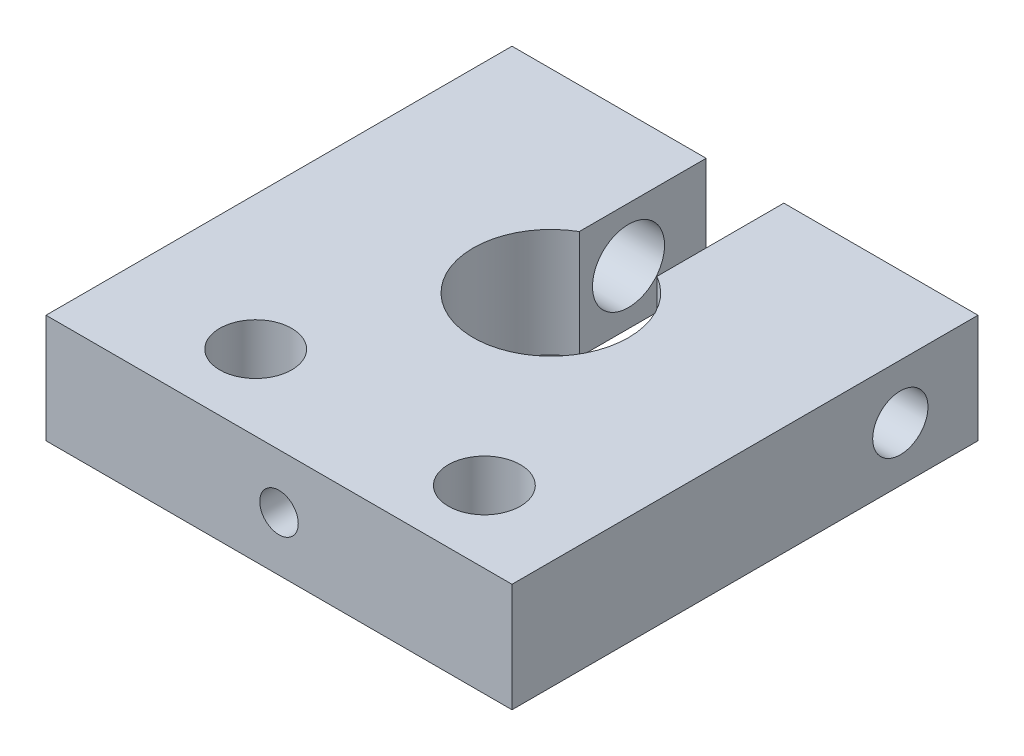
ISO-10303-21;
HEADER;
FILE_DESCRIPTION(('STEP AP214'),'2;1');
FILE_NAME('part.step','',(''),(''),'','','');
FILE_SCHEMA(('AUTOMOTIVE_DESIGN { 1 0 10303 214 1 1 1 1 }'));
ENDSEC;
DATA;
#1=APPLICATION_CONTEXT('core data for automotive mechanical design processes');
#2=APPLICATION_PROTOCOL_DEFINITION('international standard','automotive_design',2000,#1);
#3=PRODUCT_CONTEXT('',#1,'mechanical');
#4=PRODUCT('Part','Part','',(#3));
#5=PRODUCT_RELATED_PRODUCT_CATEGORY('part','',(#4));
#6=PRODUCT_DEFINITION_FORMATION('','',#4);
#7=PRODUCT_DEFINITION_CONTEXT('part definition',#1,'design');
#8=PRODUCT_DEFINITION('design','',#6,#7);
#9=PRODUCT_DEFINITION_SHAPE('','',#8);
#10=(LENGTH_UNIT() NAMED_UNIT(*) SI_UNIT(.MILLI.,.METRE.));
#11=(NAMED_UNIT(*) PLANE_ANGLE_UNIT() SI_UNIT($,.RADIAN.));
#12=(NAMED_UNIT(*) SI_UNIT($,.STERADIAN.) SOLID_ANGLE_UNIT());
#13=UNCERTAINTY_MEASURE_WITH_UNIT(LENGTH_MEASURE(1.E-05),#10,'distance_accuracy_value','');
#14=(GEOMETRIC_REPRESENTATION_CONTEXT(3) GLOBAL_UNCERTAINTY_ASSIGNED_CONTEXT((#13)) GLOBAL_UNIT_ASSIGNED_CONTEXT((#10,
#11,#12)) REPRESENTATION_CONTEXT('',''));
#15=CARTESIAN_POINT('',(0.,0.,0.));
#16=DIRECTION('',(0.,0.,1.));
#17=DIRECTION('',(1.,0.,0.));
#18=AXIS2_PLACEMENT_3D('',#15,#16,#17);
#19=CARTESIAN_POINT('',(9.525,4.445,11.1125));
#20=DIRECTION('',(-1.,0.,0.));
#21=DIRECTION('',(0.,0.,1.));
#22=AXIS2_PLACEMENT_3D('',#19,#20,#21);
#23=PLANE('',#22);
#24=DIRECTION('',(0.,0.,-1.));
#25=VECTOR('',#24,1.);
#26=CARTESIAN_POINT('',(9.525,0.,11.1125));
#27=LINE('',#26,#25);
#28=CARTESIAN_POINT('',(9.525,0.,11.1125));
#29=VERTEX_POINT('',#28);
#30=CARTESIAN_POINT('',(9.525,0.,-7.9375));
#31=VERTEX_POINT('',#30);
#32=EDGE_CURVE('E154',#29,#31,#27,.T.);
#33=ORIENTED_EDGE('',*,*,#32,.T.);
#34=DIRECTION('',(0.,-1.,0.));
#35=VECTOR('',#34,1.);
#36=CARTESIAN_POINT('',(9.525,4.445,-7.9375));
#37=LINE('',#36,#35);
#38=CARTESIAN_POINT('',(9.525,4.445,-7.9375));
#39=VERTEX_POINT('',#38);
#40=EDGE_CURVE('E160',#39,#31,#37,.T.);
#41=ORIENTED_EDGE('',*,*,#40,.F.);
#42=DIRECTION('',(0.,0.,-1.));
#43=VECTOR('',#42,1.);
#44=CARTESIAN_POINT('',(9.525,4.445,11.1125));
#45=LINE('',#44,#43);
#46=CARTESIAN_POINT('',(9.525,4.445,11.1125));
#47=VERTEX_POINT('',#46);
#48=EDGE_CURVE('E143',#47,#39,#45,.T.);
#49=ORIENTED_EDGE('',*,*,#48,.F.);
#50=DIRECTION('',(0.,-1.,0.));
#51=VECTOR('',#50,1.);
#52=CARTESIAN_POINT('',(9.525,4.445,11.1125));
#53=LINE('',#52,#51);
#54=EDGE_CURVE('E53',#47,#29,#53,.T.);
#55=ORIENTED_EDGE('',*,*,#54,.T.);
#56=EDGE_LOOP('',(#33,#41,#49,#55));
#57=FACE_BOUND('',#56,.T.);
#58=CARTESIAN_POINT('',(9.525,2.2225,-4.7625));
#59=DIRECTION('',(1.,0.,0.));
#60=DIRECTION('',(0.,0.,-1.));
#61=AXIS2_PLACEMENT_3D('',#58,#59,#60);
#62=CIRCLE('',#61,1.1303);
#63=CARTESIAN_POINT('',(9.525,2.2225,-3.6322));
#64=VERTEX_POINT('',#63);
#65=EDGE_CURVE('E253',#64,#64,#62,.T.);
#66=ORIENTED_EDGE('',*,*,#65,.F.);
#67=EDGE_LOOP('',(#66));
#68=FACE_BOUND('',#67,.T.);
#69=ADVANCED_FACE('F44',(#57,#68),#23,.F.);
#70=CARTESIAN_POINT('',(1.5875,0.,-7.9375));
#71=DIRECTION('',(1.,0.,0.));
#72=DIRECTION('',(0.,0.,-1.));
#73=AXIS2_PLACEMENT_3D('',#70,#71,#72);
#74=PLANE('',#73);
#75=DIRECTION('',(0.,0.,-1.));
#76=VECTOR('',#75,1.);
#77=CARTESIAN_POINT('',(1.5875,4.445,-7.9375));
#78=LINE('',#77,#76);
#79=CARTESIAN_POINT('',(1.5875,4.445,-2.74963065701559));
#80=VERTEX_POINT('',#79);
#81=CARTESIAN_POINT('',(1.5875,4.445,-7.9375));
#82=VERTEX_POINT('',#81);
#83=EDGE_CURVE('E126',#80,#82,#78,.T.);
#84=ORIENTED_EDGE('',*,*,#83,.T.);
#85=DIRECTION('',(0.,1.,0.));
#86=VECTOR('',#85,1.);
#87=CARTESIAN_POINT('',(1.5875,0.,-7.9375));
#88=LINE('',#87,#86);
#89=CARTESIAN_POINT('',(1.5875,0.,-7.9375));
#90=VERTEX_POINT('',#89);
#91=EDGE_CURVE('E134',#90,#82,#88,.T.);
#92=ORIENTED_EDGE('',*,*,#91,.F.);
#93=DIRECTION('',(0.,0.,-1.));
#94=VECTOR('',#93,1.);
#95=CARTESIAN_POINT('',(1.5875,0.,-7.9375));
#96=LINE('',#95,#94);
#97=CARTESIAN_POINT('',(1.5875,0.,-2.74963065701559));
#98=VERTEX_POINT('',#97);
#99=EDGE_CURVE('E61',#98,#90,#96,.T.);
#100=ORIENTED_EDGE('',*,*,#99,.F.);
#101=DIRECTION('',(0.,1.,0.));
#102=VECTOR('',#101,1.);
#103=CARTESIAN_POINT('',(1.5875,0.,-2.74963065701559));
#104=LINE('',#103,#102);
#105=EDGE_CURVE('E117',#98,#80,#104,.T.);
#106=ORIENTED_EDGE('',*,*,#105,.T.);
#107=EDGE_LOOP('',(#84,#92,#100,#106));
#108=FACE_BOUND('',#107,.T.);
#109=CARTESIAN_POINT('',(1.5875,2.2225,-4.7625));
#110=DIRECTION('',(1.,0.,0.));
#111=DIRECTION('',(0.,0.,-1.));
#112=AXIS2_PLACEMENT_3D('',#109,#110,#111);
#113=CIRCLE('',#112,1.1303);
#114=CARTESIAN_POINT('',(1.5875,2.2225,-3.6322));
#115=VERTEX_POINT('',#114);
#116=EDGE_CURVE('E173',#115,#115,#113,.F.);
#117=ORIENTED_EDGE('',*,*,#116,.F.);
#118=EDGE_LOOP('',(#117));
#119=FACE_BOUND('',#118,.T.);
#120=ADVANCED_FACE('F193',(#108,#119),#74,.F.);
#121=CARTESIAN_POINT('',(-9.525,4.445,-7.9375));
#122=DIRECTION('',(0.,0.,1.));
#123=DIRECTION('',(1.,0.,0.));
#124=AXIS2_PLACEMENT_3D('',#121,#122,#123);
#125=PLANE('',#124);
#126=DIRECTION('',(-1.,0.,0.));
#127=VECTOR('',#126,1.);
#128=CARTESIAN_POINT('',(-9.525,4.445,-7.9375));
#129=LINE('',#128,#127);
#130=CARTESIAN_POINT('',(-1.5875,4.445,-7.9375));
#131=VERTEX_POINT('',#130);
#132=CARTESIAN_POINT('',(-9.525,4.445,-7.9375));
#133=VERTEX_POINT('',#132);
#134=EDGE_CURVE('E145',#131,#133,#129,.T.);
#135=ORIENTED_EDGE('',*,*,#134,.F.);
#136=DIRECTION('',(0.,1.,0.));
#137=VECTOR('',#136,1.);
#138=CARTESIAN_POINT('',(-1.5875,0.,-7.9375));
#139=LINE('',#138,#137);
#140=CARTESIAN_POINT('',(-1.5875,0.,-7.9375));
#141=VERTEX_POINT('',#140);
#142=EDGE_CURVE('E130',#141,#131,#139,.T.);
#143=ORIENTED_EDGE('',*,*,#142,.F.);
#144=DIRECTION('',(-1.,0.,0.));
#145=VECTOR('',#144,1.);
#146=CARTESIAN_POINT('',(-9.525,0.,-7.9375));
#147=LINE('',#146,#145);
#148=CARTESIAN_POINT('',(-9.525,0.,-7.9375));
#149=VERTEX_POINT('',#148);
#150=EDGE_CURVE('E125',#141,#149,#147,.T.);
#151=ORIENTED_EDGE('',*,*,#150,.T.);
#152=DIRECTION('',(0.,-1.,0.));
#153=VECTOR('',#152,1.);
#154=CARTESIAN_POINT('',(-9.525,4.445,-7.9375));
#155=LINE('',#154,#153);
#156=EDGE_CURVE('E149',#133,#149,#155,.T.);
#157=ORIENTED_EDGE('',*,*,#156,.F.);
#158=EDGE_LOOP('',(#135,#143,#151,#157));
#159=FACE_BOUND('',#158,.T.);
#160=ADVANCED_FACE('F195',(#159),#125,.F.);
#161=CARTESIAN_POINT('',(0.,4.445,0.));
#162=DIRECTION('',(0.,-1.,0.));
#163=DIRECTION('',(0.,0.,-1.));
#164=AXIS2_PLACEMENT_3D('',#161,#162,#163);
#165=PLANE('',#164);
#166=CARTESIAN_POINT('',(-4.0386,4.445,8.0264));
#167=DIRECTION('',(0.,1.,0.));
#168=DIRECTION('',(0.,0.,1.));
#169=AXIS2_PLACEMENT_3D('',#166,#167,#168);
#170=CIRCLE('',#169,1.4732);
#171=CARTESIAN_POINT('',(-4.0386,4.445,9.4996));
#172=VERTEX_POINT('',#171);
#173=EDGE_CURVE('E171',#172,#172,#170,.T.);
#174=ORIENTED_EDGE('',*,*,#173,.F.);
#175=EDGE_LOOP('',(#174));
#176=FACE_BOUND('',#175,.T.);
#177=CARTESIAN_POINT('',(5.461,4.445,8.1788));
#178=DIRECTION('',(0.,1.,0.));
#179=DIRECTION('',(0.,0.,1.));
#180=AXIS2_PLACEMENT_3D('',#177,#178,#179);
#181=CIRCLE('',#180,1.4732);
#182=CARTESIAN_POINT('',(5.461,4.445,9.652));
#183=VERTEX_POINT('',#182);
#184=EDGE_CURVE('E244',#183,#183,#181,.T.);
#185=ORIENTED_EDGE('',*,*,#184,.F.);
#186=EDGE_LOOP('',(#185));
#187=FACE_BOUND('',#186,.T.);
#188=CARTESIAN_POINT('',(0.,4.445,0.));
#189=DIRECTION('',(0.,1.,0.));
#190=DIRECTION('',(0.,0.,1.));
#191=AXIS2_PLACEMENT_3D('',#188,#189,#190);
#192=CIRCLE('',#191,3.175);
#193=CARTESIAN_POINT('',(-1.5875,4.445,-2.74963065701559));
#194=VERTEX_POINT('',#193);
#195=EDGE_CURVE('E129',#194,#80,#192,.T.);
#196=ORIENTED_EDGE('',*,*,#195,.F.);
#197=DIRECTION('',(0.,0.,1.));
#198=VECTOR('',#197,1.);
#199=CARTESIAN_POINT('',(-1.5875,4.445,-7.9375));
#200=LINE('',#199,#198);
#201=EDGE_CURVE('E69',#131,#194,#200,.T.);
#202=ORIENTED_EDGE('',*,*,#201,.F.);
#203=ORIENTED_EDGE('',*,*,#134,.T.);
#204=DIRECTION('',(0.,0.,1.));
#205=VECTOR('',#204,1.);
#206=CARTESIAN_POINT('',(-9.525,4.445,11.1125));
#207=LINE('',#206,#205);
#208=CARTESIAN_POINT('',(-9.525,4.445,11.1125));
#209=VERTEX_POINT('',#208);
#210=EDGE_CURVE('E137',#133,#209,#207,.T.);
#211=ORIENTED_EDGE('',*,*,#210,.T.);
#212=DIRECTION('',(1.,0.,0.));
#213=VECTOR('',#212,1.);
#214=CARTESIAN_POINT('',(-9.525,4.445,11.1125));
#215=LINE('',#214,#213);
#216=EDGE_CURVE('E140',#209,#47,#215,.T.);
#217=ORIENTED_EDGE('',*,*,#216,.T.);
#218=ORIENTED_EDGE('',*,*,#48,.T.);
#219=EDGE_CURVE('E146',#39,#82,#129,.T.);
#220=ORIENTED_EDGE('',*,*,#219,.T.);
#221=ORIENTED_EDGE('',*,*,#83,.F.);
#222=EDGE_LOOP('',(#196,#202,#203,#211,#217,#218,#220,#221));
#223=FACE_BOUND('',#222,.T.);
#224=ADVANCED_FACE('F234',(#176,#187,#223),#165,.F.);
#225=CARTESIAN_POINT('',(0.,0.,0.));
#226=DIRECTION('',(0.,-1.,0.));
#227=DIRECTION('',(0.,0.,-1.));
#228=AXIS2_PLACEMENT_3D('',#225,#226,#227);
#229=PLANE('',#228);
#230=CARTESIAN_POINT('',(-4.0386,0.,8.0264));
#231=DIRECTION('',(0.,1.,0.));
#232=DIRECTION('',(0.,0.,1.));
#233=AXIS2_PLACEMENT_3D('',#230,#231,#232);
#234=CIRCLE('',#233,1.4732);
#235=CARTESIAN_POINT('',(-4.0386,0.,9.4996));
#236=VERTEX_POINT('',#235);
#237=EDGE_CURVE('E262',#236,#236,#234,.T.);
#238=ORIENTED_EDGE('',*,*,#237,.T.);
#239=EDGE_LOOP('',(#238));
#240=FACE_BOUND('',#239,.T.);
#241=CARTESIAN_POINT('',(5.461,0.,8.1788));
#242=DIRECTION('',(0.,1.,0.));
#243=DIRECTION('',(0.,0.,1.));
#244=AXIS2_PLACEMENT_3D('',#241,#242,#243);
#245=CIRCLE('',#244,1.4732);
#246=CARTESIAN_POINT('',(5.461,0.,9.652));
#247=VERTEX_POINT('',#246);
#248=EDGE_CURVE('E240',#247,#247,#245,.T.);
#249=ORIENTED_EDGE('',*,*,#248,.T.);
#250=EDGE_LOOP('',(#249));
#251=FACE_BOUND('',#250,.T.);
#252=DIRECTION('',(0.,0.,1.));
#253=VECTOR('',#252,1.);
#254=CARTESIAN_POINT('',(-1.5875,0.,-7.9375));
#255=LINE('',#254,#253);
#256=CARTESIAN_POINT('',(-1.5875,0.,-2.74963065701559));
#257=VERTEX_POINT('',#256);
#258=EDGE_CURVE('E111',#141,#257,#255,.T.);
#259=ORIENTED_EDGE('',*,*,#258,.T.);
#260=CARTESIAN_POINT('',(0.,0.,0.));
#261=DIRECTION('',(0.,1.,0.));
#262=DIRECTION('',(0.,0.,1.));
#263=AXIS2_PLACEMENT_3D('',#260,#261,#262);
#264=CIRCLE('',#263,3.175);
#265=EDGE_CURVE('E123',#257,#98,#264,.T.);
#266=ORIENTED_EDGE('',*,*,#265,.T.);
#267=ORIENTED_EDGE('',*,*,#99,.T.);
#268=EDGE_CURVE('E141',#31,#90,#147,.T.);
#269=ORIENTED_EDGE('',*,*,#268,.F.);
#270=ORIENTED_EDGE('',*,*,#32,.F.);
#271=DIRECTION('',(1.,0.,0.));
#272=VECTOR('',#271,1.);
#273=CARTESIAN_POINT('',(-9.525,0.,11.1125));
#274=LINE('',#273,#272);
#275=CARTESIAN_POINT('',(-9.525,0.,11.1125));
#276=VERTEX_POINT('',#275);
#277=EDGE_CURVE('E152',#276,#29,#274,.T.);
#278=ORIENTED_EDGE('',*,*,#277,.F.);
#279=DIRECTION('',(0.,0.,1.));
#280=VECTOR('',#279,1.);
#281=CARTESIAN_POINT('',(-9.525,0.,11.1125));
#282=LINE('',#281,#280);
#283=EDGE_CURVE('E132',#149,#276,#282,.T.);
#284=ORIENTED_EDGE('',*,*,#283,.F.);
#285=ORIENTED_EDGE('',*,*,#150,.F.);
#286=EDGE_LOOP('',(#259,#266,#267,#269,#270,#278,#284,#285));
#287=FACE_BOUND('',#286,.T.);
#288=ADVANCED_FACE('F122',(#240,#251,#287),#229,.T.);
#289=CARTESIAN_POINT('',(-9.525,4.445,11.1125));
#290=DIRECTION('',(1.,0.,0.));
#291=DIRECTION('',(0.,0.,-1.));
#292=AXIS2_PLACEMENT_3D('',#289,#290,#291);
#293=PLANE('',#292);
#294=CARTESIAN_POINT('',(-9.525,2.2225,-4.7625));
#295=DIRECTION('',(1.,0.,0.));
#296=DIRECTION('',(0.,0.,-1.));
#297=AXIS2_PLACEMENT_3D('',#294,#295,#296);
#298=CIRCLE('',#297,1.4732);
#299=CARTESIAN_POINT('',(-9.525,2.2225,-6.2357));
#300=VERTEX_POINT('',#299);
#301=EDGE_CURVE('E259',#300,#300,#298,.T.);
#302=ORIENTED_EDGE('',*,*,#301,.T.);
#303=EDGE_LOOP('',(#302));
#304=FACE_BOUND('',#303,.T.);
#305=ORIENTED_EDGE('',*,*,#283,.T.);
#306=DIRECTION('',(0.,-1.,0.));
#307=VECTOR('',#306,1.);
#308=CARTESIAN_POINT('',(-9.525,4.445,11.1125));
#309=LINE('',#308,#307);
#310=EDGE_CURVE('E13',#209,#276,#309,.T.);
#311=ORIENTED_EDGE('',*,*,#310,.F.);
#312=ORIENTED_EDGE('',*,*,#210,.F.);
#313=ORIENTED_EDGE('',*,*,#156,.T.);
#314=EDGE_LOOP('',(#305,#311,#312,#313));
#315=FACE_BOUND('',#314,.T.);
#316=ADVANCED_FACE('F46',(#304,#315),#293,.F.);
#317=CARTESIAN_POINT('',(-9.525,4.445,11.1125));
#318=DIRECTION('',(0.,0.,-1.));
#319=DIRECTION('',(-1.,0.,0.));
#320=AXIS2_PLACEMENT_3D('',#317,#318,#319);
#321=PLANE('',#320);
#322=CARTESIAN_POINT('',(0.,2.2225,11.1125));
#323=DIRECTION('',(0.,0.,1.));
#324=DIRECTION('',(1.,0.,0.));
#325=AXIS2_PLACEMENT_3D('',#322,#323,#324);
#326=CIRCLE('',#325,0.7874);
#327=CARTESIAN_POINT('',(0.7874,2.2225,11.1125));
#328=VERTEX_POINT('',#327);
#329=EDGE_CURVE('E172',#328,#328,#326,.T.);
#330=ORIENTED_EDGE('',*,*,#329,.F.);
#331=EDGE_LOOP('',(#330));
#332=FACE_BOUND('',#331,.T.);
#333=ORIENTED_EDGE('',*,*,#277,.T.);
#334=ORIENTED_EDGE('',*,*,#54,.F.);
#335=ORIENTED_EDGE('',*,*,#216,.F.);
#336=ORIENTED_EDGE('',*,*,#310,.T.);
#337=EDGE_LOOP('',(#333,#334,#335,#336));
#338=FACE_BOUND('',#337,.T.);
#339=ADVANCED_FACE('F212',(#332,#338),#321,.F.);
#340=ORIENTED_EDGE('',*,*,#268,.T.);
#341=ORIENTED_EDGE('',*,*,#91,.T.);
#342=ORIENTED_EDGE('',*,*,#219,.F.);
#343=ORIENTED_EDGE('',*,*,#40,.T.);
#344=EDGE_LOOP('',(#340,#341,#342,#343));
#345=FACE_BOUND('',#344,.T.);
#346=ADVANCED_FACE('F201',(#345),#125,.F.);
#347=CARTESIAN_POINT('',(0.,4.445,0.));
#348=DIRECTION('',(0.,-1.,0.));
#349=DIRECTION('',(0.,0.,-1.));
#350=AXIS2_PLACEMENT_3D('',#347,#348,#349);
#351=CYLINDRICAL_SURFACE('',#350,3.175);
#352=CARTESIAN_POINT('',(0.7874,2.2225,3.07581310225442));
#353=CARTESIAN_POINT('',(0.787398744653917,2.17900750216941,3.075813939192));
#354=CARTESIAN_POINT('',(0.783784226445853,2.13550103699984,3.07674566145374));
#355=CARTESIAN_POINT('',(0.769444212040904,2.04973664816889,3.0803625423924));
#356=CARTESIAN_POINT('',(0.75871451031931,2.00747947835965,3.08304873806023));
#357=CARTESIAN_POINT('',(0.730512083187864,1.92546662188354,3.08985205147743));
#358=CARTESIAN_POINT('',(0.713047973268174,1.88570781427514,3.09396734028734));
#359=CARTESIAN_POINT('',(0.671898613390606,1.80968029137026,3.10316287879354));
#360=CARTESIAN_POINT('',(0.648213125219557,1.7734117097853,3.10824316543701));
#361=CARTESIAN_POINT('',(0.594745480228862,1.70460863740529,3.11891943941669));
#362=CARTESIAN_POINT('',(0.564853320914092,1.67216087582295,3.12452355873939));
#363=CARTESIAN_POINT('',(0.500057836854161,1.6126842784334,3.13554546853051));
#364=CARTESIAN_POINT('',(0.465154049806476,1.58565594309829,3.14096324175205));
#365=CARTESIAN_POINT('',(0.390732789039581,1.53743138615076,3.15109190098522));
#366=CARTESIAN_POINT('',(0.351158598507653,1.51632024601062,3.15579207165152));
#367=CARTESIAN_POINT('',(0.268887241267556,1.48108236631455,3.16386323206304));
#368=CARTESIAN_POINT('',(0.226190528800391,1.4669546131789,3.1672344146853));
#369=CARTESIAN_POINT('',(0.139790139759614,1.44636200190988,3.17221027199584));
#370=CARTESIAN_POINT('',(0.0961235443472492,1.43974989496921,3.17384884607327));
#371=CARTESIAN_POINT('',(0.00827220844257335,1.43391418710287,3.17529294846481));
#372=CARTESIAN_POINT('',(-0.0359124556806585,1.43468951053071,3.17509874364066));
#373=CARTESIAN_POINT('',(-0.122524852571927,1.44350049547967,3.17292445001065));
#374=CARTESIAN_POINT('',(-0.164969881520884,1.45137723188311,3.1709834549647));
#375=CARTESIAN_POINT('',(-0.247915901823041,1.47391214765311,3.16557912503432));
#376=CARTESIAN_POINT('',(-0.288416790498507,1.48857068475941,3.16211570984276));
#377=CARTESIAN_POINT('',(-0.366745072334393,1.52438248465348,3.15399567959344));
#378=CARTESIAN_POINT('',(-0.404545374544142,1.54559255235268,3.14932868981507));
#379=CARTESIAN_POINT('',(-0.476106034644211,1.59386229878054,3.13930813357491));
#380=CARTESIAN_POINT('',(-0.509865698165378,1.62092298068023,3.13395444943371));
#381=CARTESIAN_POINT('',(-0.573334431368741,1.68097867569626,3.12297597059372));
#382=CARTESIAN_POINT('',(-0.602911621812153,1.71411258434032,3.11734775299395));
#383=CARTESIAN_POINT('',(-0.656118863638047,1.78492902507928,3.10658526700961));
#384=CARTESIAN_POINT('',(-0.679748646071947,1.82261176276347,3.10145102096949));
#385=CARTESIAN_POINT('',(-0.720472946534792,1.90171177009863,3.09224573629719));
#386=CARTESIAN_POINT('',(-0.737536183225515,1.94314578145341,3.08817981532904));
#387=CARTESIAN_POINT('',(-0.7644140444088,2.02841937179795,3.08163748493669));
#388=CARTESIAN_POINT('',(-0.774230192058727,2.07225844322203,3.07916074152135));
#389=CARTESIAN_POINT('',(-0.786117397865362,2.1598759080488,3.07614716365072));
#390=CARTESIAN_POINT('',(-0.788383246102545,2.20362622746548,3.0755615524555));
#391=CARTESIAN_POINT('',(-0.78563841377291,2.29087987623272,3.07626385331309));
#392=CARTESIAN_POINT('',(-0.780628391181266,2.33438322756007,3.07755159595384));
#393=CARTESIAN_POINT('',(-0.763644712630664,2.41918781628929,3.08180881345485));
#394=CARTESIAN_POINT('',(-0.751784048072299,2.46051318363588,3.08475098063085));
#395=CARTESIAN_POINT('',(-0.721560843905089,2.54058920748939,3.09195969992218));
#396=CARTESIAN_POINT('',(-0.703197543579799,2.57933956212605,3.09622640698274));
#397=CARTESIAN_POINT('',(-0.660081187835404,2.65399211019935,3.10570645375419));
#398=CARTESIAN_POINT('',(-0.635211433408581,2.68982473409086,3.11093650401891));
#399=CARTESIAN_POINT('',(-0.579936031663543,2.75687965259862,3.12171274313181));
#400=CARTESIAN_POINT('',(-0.549529489740265,2.7881012007029,3.12725898296862));
#401=CARTESIAN_POINT('',(-0.48315051811217,2.84583452429436,3.13820768442019));
#402=CARTESIAN_POINT('',(-0.447059655482856,2.87221167896369,3.14360326164024));
#403=CARTESIAN_POINT('',(-0.370847613185458,2.91853077035707,3.15350144612221));
#404=CARTESIAN_POINT('',(-0.330726642963906,2.9384730412783,3.15800409975364));
#405=CARTESIAN_POINT('',(-0.247869409728027,2.97118451574826,3.16558085850935));
#406=CARTESIAN_POINT('',(-0.205154367753035,2.98400500137962,3.16866514841085));
#407=CARTESIAN_POINT('',(-0.118089634527152,3.00226342277996,3.17310221692133));
#408=CARTESIAN_POINT('',(-0.0737402550265626,3.0077027590944,3.17445532401298));
#409=CARTESIAN_POINT('',(0.0140686802248654,3.01096675001191,3.17526440669889));
#410=CARTESIAN_POINT('',(0.0575205020657554,3.00899022295012,3.17476991760286));
#411=CARTESIAN_POINT('',(0.143452325637751,2.99793325870032,3.17204896452848));
#412=CARTESIAN_POINT('',(0.185932355396543,2.98885302665849,3.16982255056599));
#413=CARTESIAN_POINT('',(0.268510280526712,2.9639523243211,3.16389530862677));
#414=CARTESIAN_POINT('',(0.308619453963481,2.9481672884411,3.16020223840382));
#415=CARTESIAN_POINT('',(0.385642600762486,2.91033730635837,3.15173092032296));
#416=CARTESIAN_POINT('',(0.422556176271458,2.88829158215568,3.14695253761078));
#417=CARTESIAN_POINT('',(0.493084900281431,2.83795682571119,3.13668511744754));
#418=CARTESIAN_POINT('',(0.52660147706722,2.8095325551554,3.13118195361417));
#419=CARTESIAN_POINT('',(0.588456610505146,2.74751083497311,3.12014954155491));
#420=CARTESIAN_POINT('',(0.616793857602899,2.7139120809635,3.11462028709371));
#421=CARTESIAN_POINT('',(0.667993949997186,2.64175578960346,3.10404681922997));
#422=CARTESIAN_POINT('',(0.69074725054112,2.60311883096044,3.09901332040041));
#423=CARTESIAN_POINT('',(0.729401479098359,2.52244904181384,3.09014474773968));
#424=CARTESIAN_POINT('',(0.745307449526481,2.48041873737094,3.08630879260421));
#425=CARTESIAN_POINT('',(0.767414999781062,2.40246143803863,3.08087672885657));
#426=CARTESIAN_POINT('',(0.774893177484593,2.36691121132723,3.07899203964911));
#427=CARTESIAN_POINT('',(0.784885996993762,2.29507719135974,3.07645992809139));
#428=CARTESIAN_POINT('',(0.787401047556558,2.258793458763,3.07581240384985));
#429=CARTESIAN_POINT('',(0.7874,2.2225,3.07581310225442));
#430=B_SPLINE_CURVE_WITH_KNOTS('',3,(#352,#353,#354,#355,#356,#357,#358,#359,#360,#361,#362,
#363,#364,#365,#366,#367,#368,#369,#370,#371,#372,#373,#374,#375,#376,#377,#378,#379,#380,#381,
#382,#383,#384,#385,#386,#387,#388,#389,#390,#391,#392,#393,#394,#395,#396,#397,#398,#399,#400,
#401,#402,#403,#404,#405,#406,#407,#408,#409,#410,#411,#412,#413,#414,#415,#416,#417,#418,#419,
#420,#421,#422,#423,#424,#425,#426,#427,#428,#429),.UNSPECIFIED.,.T.,.F.,(4,2,2,2,2,2,2,2,2,2,2,
2,2,2,2,2,2,2,2,2,2,2,2,2,2,2,2,2,2,2,2,2,2,2,2,2,2,2,4),(0.,0.13034423175165,0.260765573961924,
0.391020615621169,0.521280645401966,0.654083865117332,0.786899343275962,0.921536587148749,
1.05615428381907,1.18808641559695,1.31999933769578,1.44903147118194,1.57807041188435,
1.70826117252596,1.8384742739541,1.97215653148636,2.10584483319729,2.24016233276009,
2.37445159409166,2.50524834212076,2.63603326260977,2.76472028769879,2.89342237232645,
3.02461332123561,3.15582548612889,3.29026266290113,3.42469285652325,3.55814207277701,
3.69156596399904,3.82143865850466,3.95130760258651,4.08049857472727,4.20970560813495,
4.34196626996364,4.47426032677967,4.6089727912647,4.74358588227683,4.85236401401125,
4.96113318653611),.UNSPECIFIED.);
#431=CARTESIAN_POINT('',(0.7874,2.2225,3.07581310225442));
#432=VERTEX_POINT('',#431);
#433=EDGE_CURVE('E165',#432,#432,#430,.T.);
#434=ORIENTED_EDGE('',*,*,#433,.F.);
#435=EDGE_LOOP('',(#434));
#436=FACE_BOUND('',#435,.T.);
#437=DIRECTION('',(0.,1.,0.));
#438=VECTOR('',#437,1.);
#439=CARTESIAN_POINT('',(-1.5875,0.,-2.74963065701559));
#440=LINE('',#439,#438);
#441=EDGE_CURVE('E108',#257,#194,#440,.T.);
#442=ORIENTED_EDGE('',*,*,#441,.T.);
#443=ORIENTED_EDGE('',*,*,#195,.T.);
#444=ORIENTED_EDGE('',*,*,#105,.F.);
#445=ORIENTED_EDGE('',*,*,#265,.F.);
#446=EDGE_LOOP('',(#442,#443,#444,#445));
#447=FACE_BOUND('',#446,.T.);
#448=ADVANCED_FACE('F128',(#436,#447),#351,.F.);
#449=CARTESIAN_POINT('',(-1.5875,0.,-7.9375));
#450=DIRECTION('',(-1.,0.,0.));
#451=DIRECTION('',(0.,0.,1.));
#452=AXIS2_PLACEMENT_3D('',#449,#450,#451);
#453=PLANE('',#452);
#454=CARTESIAN_POINT('',(-1.5875,2.2225,-4.7625));
#455=DIRECTION('',(-1.,0.,0.));
#456=DIRECTION('',(0.,0.,1.));
#457=AXIS2_PLACEMENT_3D('',#454,#455,#456);
#458=CIRCLE('',#457,1.4732);
#459=CARTESIAN_POINT('',(-1.5875,2.2225,-6.2357));
#460=VERTEX_POINT('',#459);
#461=EDGE_CURVE('E48',#460,#460,#458,.T.);
#462=ORIENTED_EDGE('',*,*,#461,.T.);
#463=EDGE_LOOP('',(#462));
#464=FACE_BOUND('',#463,.T.);
#465=ORIENTED_EDGE('',*,*,#201,.T.);
#466=ORIENTED_EDGE('',*,*,#441,.F.);
#467=ORIENTED_EDGE('',*,*,#258,.F.);
#468=ORIENTED_EDGE('',*,*,#142,.T.);
#469=EDGE_LOOP('',(#465,#466,#467,#468));
#470=FACE_BOUND('',#469,.T.);
#471=ADVANCED_FACE('F110',(#464,#470),#453,.F.);
#472=CARTESIAN_POINT('',(5.461,0.,8.1788));
#473=DIRECTION('',(0.,1.,0.));
#474=DIRECTION('',(0.,0.,1.));
#475=AXIS2_PLACEMENT_3D('',#472,#473,#474);
#476=CYLINDRICAL_SURFACE('',#475,1.4732);
#477=ORIENTED_EDGE('',*,*,#248,.F.);
#478=EDGE_LOOP('',(#477));
#479=FACE_BOUND('',#478,.T.);
#480=ORIENTED_EDGE('',*,*,#184,.T.);
#481=EDGE_LOOP('',(#480));
#482=FACE_BOUND('',#481,.T.);
#483=ADVANCED_FACE('F188',(#479,#482),#476,.F.);
#484=CARTESIAN_POINT('',(-4.0386,0.,8.0264));
#485=DIRECTION('',(0.,1.,0.));
#486=DIRECTION('',(0.,0.,1.));
#487=AXIS2_PLACEMENT_3D('',#484,#485,#486);
#488=CYLINDRICAL_SURFACE('',#487,1.4732);
#489=ORIENTED_EDGE('',*,*,#237,.F.);
#490=EDGE_LOOP('',(#489));
#491=FACE_BOUND('',#490,.T.);
#492=ORIENTED_EDGE('',*,*,#173,.T.);
#493=EDGE_LOOP('',(#492));
#494=FACE_BOUND('',#493,.T.);
#495=ADVANCED_FACE('F183',(#491,#494),#488,.F.);
#496=CARTESIAN_POINT('',(0.,2.2225,-7.9375));
#497=DIRECTION('',(0.,0.,1.));
#498=DIRECTION('',(1.,0.,0.));
#499=AXIS2_PLACEMENT_3D('',#496,#497,#498);
#500=CYLINDRICAL_SURFACE('',#499,0.7874);
#501=ORIENTED_EDGE('',*,*,#433,.T.);
#502=EDGE_LOOP('',(#501));
#503=FACE_BOUND('',#502,.T.);
#504=ORIENTED_EDGE('',*,*,#329,.T.);
#505=EDGE_LOOP('',(#504));
#506=FACE_BOUND('',#505,.T.);
#507=ADVANCED_FACE('F177',(#503,#506),#500,.F.);
#508=CARTESIAN_POINT('',(9.525,2.2225,-4.7625));
#509=DIRECTION('',(-1.,0.,0.));
#510=DIRECTION('',(0.,0.,1.));
#511=AXIS2_PLACEMENT_3D('',#508,#509,#510);
#512=CYLINDRICAL_SURFACE('',#511,1.1303);
#513=CARTESIAN_POINT('',(9.525,2.2225,-3.6322));
#514=CARTESIAN_POINT('',(9.44231770833333,2.2225,-3.6322));
#515=CARTESIAN_POINT('',(9.35963541666667,2.2225,-3.6322));
#516=CARTESIAN_POINT('',(9.19427083333333,2.2225,-3.6322));
#517=CARTESIAN_POINT('',(9.11158854166667,2.2225,-3.6322));
#518=CARTESIAN_POINT('',(8.94622395833333,2.2225,-3.6322));
#519=CARTESIAN_POINT('',(8.86354166666667,2.2225,-3.6322));
#520=CARTESIAN_POINT('',(8.69817708333333,2.2225,-3.6322));
#521=CARTESIAN_POINT('',(8.61549479166667,2.2225,-3.6322));
#522=CARTESIAN_POINT('',(8.45013020833333,2.2225,-3.6322));
#523=CARTESIAN_POINT('',(8.36744791666667,2.2225,-3.6322));
#524=CARTESIAN_POINT('',(8.20208333333333,2.2225,-3.6322));
#525=CARTESIAN_POINT('',(8.11940104166667,2.2225,-3.6322));
#526=CARTESIAN_POINT('',(7.95403645833333,2.2225,-3.6322));
#527=CARTESIAN_POINT('',(7.87135416666667,2.2225,-3.6322));
#528=CARTESIAN_POINT('',(7.70598958333333,2.2225,-3.6322));
#529=CARTESIAN_POINT('',(7.62330729166667,2.2225,-3.6322));
#530=CARTESIAN_POINT('',(7.45794270833333,2.2225,-3.6322));
#531=CARTESIAN_POINT('',(7.37526041666667,2.2225,-3.6322));
#532=CARTESIAN_POINT('',(7.20989583333333,2.2225,-3.6322));
#533=CARTESIAN_POINT('',(7.12721354166667,2.2225,-3.6322));
#534=CARTESIAN_POINT('',(6.96184895833333,2.2225,-3.6322));
#535=CARTESIAN_POINT('',(6.87916666666667,2.2225,-3.6322));
#536=CARTESIAN_POINT('',(6.71380208333333,2.2225,-3.6322));
#537=CARTESIAN_POINT('',(6.63111979166667,2.2225,-3.6322));
#538=CARTESIAN_POINT('',(6.46575520833333,2.2225,-3.6322));
#539=CARTESIAN_POINT('',(6.38307291666667,2.2225,-3.6322));
#540=CARTESIAN_POINT('',(6.21770833333333,2.2225,-3.6322));
#541=CARTESIAN_POINT('',(6.13502604166667,2.2225,-3.6322));
#542=CARTESIAN_POINT('',(5.96966145833333,2.2225,-3.6322));
#543=CARTESIAN_POINT('',(5.88697916666667,2.2225,-3.6322));
#544=CARTESIAN_POINT('',(5.72161458333333,2.2225,-3.6322));
#545=CARTESIAN_POINT('',(5.63893229166667,2.2225,-3.6322));
#546=CARTESIAN_POINT('',(5.47356770833333,2.2225,-3.6322));
#547=CARTESIAN_POINT('',(5.39088541666667,2.2225,-3.6322));
#548=CARTESIAN_POINT('',(5.22552083333333,2.2225,-3.6322));
#549=CARTESIAN_POINT('',(5.14283854166667,2.2225,-3.6322));
#550=CARTESIAN_POINT('',(4.97747395833333,2.2225,-3.6322));
#551=CARTESIAN_POINT('',(4.89479166666667,2.2225,-3.6322));
#552=CARTESIAN_POINT('',(4.72942708333333,2.2225,-3.6322));
#553=CARTESIAN_POINT('',(4.64674479166667,2.2225,-3.6322));
#554=CARTESIAN_POINT('',(4.48138020833333,2.2225,-3.6322));
#555=CARTESIAN_POINT('',(4.39869791666667,2.2225,-3.6322));
#556=CARTESIAN_POINT('',(4.23333333333333,2.2225,-3.6322));
#557=CARTESIAN_POINT('',(4.15065104166667,2.2225,-3.6322));
#558=CARTESIAN_POINT('',(3.98528645833333,2.2225,-3.6322));
#559=CARTESIAN_POINT('',(3.90260416666667,2.2225,-3.6322));
#560=CARTESIAN_POINT('',(3.73723958333333,2.2225,-3.6322));
#561=CARTESIAN_POINT('',(3.65455729166667,2.2225,-3.6322));
#562=CARTESIAN_POINT('',(3.48919270833333,2.2225,-3.6322));
#563=CARTESIAN_POINT('',(3.40651041666667,2.2225,-3.6322));
#564=CARTESIAN_POINT('',(3.24114583333333,2.2225,-3.6322));
#565=CARTESIAN_POINT('',(3.15846354166667,2.2225,-3.6322));
#566=CARTESIAN_POINT('',(2.99309895833333,2.2225,-3.6322));
#567=CARTESIAN_POINT('',(2.91041666666667,2.2225,-3.6322));
#568=CARTESIAN_POINT('',(2.74505208333333,2.2225,-3.6322));
#569=CARTESIAN_POINT('',(2.66236979166667,2.2225,-3.6322));
#570=CARTESIAN_POINT('',(2.49700520833333,2.2225,-3.6322));
#571=CARTESIAN_POINT('',(2.41432291666667,2.2225,-3.6322));
#572=CARTESIAN_POINT('',(2.24895833333333,2.2225,-3.6322));
#573=CARTESIAN_POINT('',(2.16627604166667,2.2225,-3.6322));
#574=CARTESIAN_POINT('',(2.00091145833333,2.2225,-3.6322));
#575=CARTESIAN_POINT('',(1.91822916666667,2.2225,-3.6322));
#576=CARTESIAN_POINT('',(1.75286458333333,2.2225,-3.6322));
#577=CARTESIAN_POINT('',(1.67018229166667,2.2225,-3.6322));
#578=CARTESIAN_POINT('',(1.5875,2.2225,-3.6322));
#579=B_SPLINE_CURVE_WITH_KNOTS('',3,(#513,#514,#515,#516,#517,#518,#519,#520,#521,#522,#523,
#524,#525,#526,#527,#528,#529,#530,#531,#532,#533,#534,#535,#536,#537,#538,#539,#540,#541,#542,
#543,#544,#545,#546,#547,#548,#549,#550,#551,#552,#553,#554,#555,#556,#557,#558,#559,#560,#561,
#562,#563,#564,#565,#566,#567,#568,#569,#570,#571,#572,#573,#574,#575,#576,#577,#578),
.UNSPECIFIED.,.F.,.F.,(4,2,2,2,2,2,2,2,2,2,2,2,2,2,2,2,2,2,2,2,2,2,2,2,2,2,2,2,2,2,2,2,4),(0.,
0.248046875,0.496093749999999,0.744140624999999,0.992187499999998,1.240234375,1.48828125,
1.736328125,1.984375,2.232421875,2.48046875,2.728515625,2.9765625,3.224609375,3.47265625,
3.720703125,3.96875,4.216796875,4.46484375,4.712890625,4.9609375,5.208984375,5.45703125,
5.705078125,5.953125,6.201171875,6.44921875,6.697265625,6.9453125,7.193359375,7.44140625,
7.689453125,7.9375),.UNSPECIFIED.);
#580=EDGE_CURVE('BSEAM182',#64,#115,#579,.T.);
#581=ORIENTED_EDGE('',*,*,#65,.T.);
#582=ORIENTED_EDGE('',*,*,#116,.T.);
#583=ORIENTED_EDGE('',*,*,#580,.T.);
#584=ORIENTED_EDGE('',*,*,#580,.F.);
#585=EDGE_LOOP('',(#581,#583,#582,#584));
#586=FACE_BOUND('',#585,.T.);
#587=ADVANCED_FACE('F182',(#586),#512,.F.);
#588=CARTESIAN_POINT('',(-9.525,2.2225,-4.7625));
#589=DIRECTION('',(1.,0.,0.));
#590=DIRECTION('',(0.,0.,-1.));
#591=AXIS2_PLACEMENT_3D('',#588,#589,#590);
#592=CYLINDRICAL_SURFACE('',#591,1.4732);
#593=CARTESIAN_POINT('',(-9.525,2.2225,-6.2357));
#594=CARTESIAN_POINT('',(-9.44231770833333,2.2225,-6.2357));
#595=CARTESIAN_POINT('',(-9.35963541666667,2.2225,-6.2357));
#596=CARTESIAN_POINT('',(-9.19427083333333,2.2225,-6.2357));
#597=CARTESIAN_POINT('',(-9.11158854166667,2.2225,-6.2357));
#598=CARTESIAN_POINT('',(-8.94622395833333,2.2225,-6.2357));
#599=CARTESIAN_POINT('',(-8.86354166666667,2.2225,-6.2357));
#600=CARTESIAN_POINT('',(-8.69817708333333,2.2225,-6.2357));
#601=CARTESIAN_POINT('',(-8.61549479166667,2.2225,-6.2357));
#602=CARTESIAN_POINT('',(-8.45013020833333,2.2225,-6.2357));
#603=CARTESIAN_POINT('',(-8.36744791666667,2.2225,-6.2357));
#604=CARTESIAN_POINT('',(-8.20208333333333,2.2225,-6.2357));
#605=CARTESIAN_POINT('',(-8.11940104166667,2.2225,-6.2357));
#606=CARTESIAN_POINT('',(-7.95403645833333,2.2225,-6.2357));
#607=CARTESIAN_POINT('',(-7.87135416666667,2.2225,-6.2357));
#608=CARTESIAN_POINT('',(-7.70598958333333,2.2225,-6.2357));
#609=CARTESIAN_POINT('',(-7.62330729166667,2.2225,-6.2357));
#610=CARTESIAN_POINT('',(-7.45794270833333,2.2225,-6.2357));
#611=CARTESIAN_POINT('',(-7.37526041666667,2.2225,-6.2357));
#612=CARTESIAN_POINT('',(-7.20989583333333,2.2225,-6.2357));
#613=CARTESIAN_POINT('',(-7.12721354166667,2.2225,-6.2357));
#614=CARTESIAN_POINT('',(-6.96184895833334,2.2225,-6.2357));
#615=CARTESIAN_POINT('',(-6.87916666666667,2.2225,-6.2357));
#616=CARTESIAN_POINT('',(-6.71380208333333,2.2225,-6.2357));
#617=CARTESIAN_POINT('',(-6.63111979166667,2.2225,-6.2357));
#618=CARTESIAN_POINT('',(-6.46575520833333,2.2225,-6.2357));
#619=CARTESIAN_POINT('',(-6.38307291666667,2.2225,-6.2357));
#620=CARTESIAN_POINT('',(-6.21770833333333,2.2225,-6.2357));
#621=CARTESIAN_POINT('',(-6.13502604166667,2.2225,-6.2357));
#622=CARTESIAN_POINT('',(-5.96966145833333,2.2225,-6.2357));
#623=CARTESIAN_POINT('',(-5.88697916666667,2.2225,-6.2357));
#624=CARTESIAN_POINT('',(-5.72161458333333,2.2225,-6.2357));
#625=CARTESIAN_POINT('',(-5.63893229166667,2.2225,-6.2357));
#626=CARTESIAN_POINT('',(-5.47356770833333,2.2225,-6.2357));
#627=CARTESIAN_POINT('',(-5.39088541666667,2.2225,-6.2357));
#628=CARTESIAN_POINT('',(-5.22552083333333,2.2225,-6.2357));
#629=CARTESIAN_POINT('',(-5.14283854166667,2.2225,-6.2357));
#630=CARTESIAN_POINT('',(-4.97747395833333,2.2225,-6.2357));
#631=CARTESIAN_POINT('',(-4.89479166666667,2.2225,-6.2357));
#632=CARTESIAN_POINT('',(-4.72942708333333,2.2225,-6.2357));
#633=CARTESIAN_POINT('',(-4.64674479166667,2.2225,-6.2357));
#634=CARTESIAN_POINT('',(-4.48138020833333,2.2225,-6.2357));
#635=CARTESIAN_POINT('',(-4.39869791666667,2.2225,-6.2357));
#636=CARTESIAN_POINT('',(-4.23333333333333,2.2225,-6.2357));
#637=CARTESIAN_POINT('',(-4.15065104166667,2.2225,-6.2357));
#638=CARTESIAN_POINT('',(-3.98528645833333,2.2225,-6.2357));
#639=CARTESIAN_POINT('',(-3.90260416666667,2.2225,-6.2357));
#640=CARTESIAN_POINT('',(-3.73723958333333,2.2225,-6.2357));
#641=CARTESIAN_POINT('',(-3.65455729166667,2.2225,-6.2357));
#642=CARTESIAN_POINT('',(-3.48919270833333,2.2225,-6.2357));
#643=CARTESIAN_POINT('',(-3.40651041666667,2.2225,-6.2357));
#644=CARTESIAN_POINT('',(-3.24114583333333,2.2225,-6.2357));
#645=CARTESIAN_POINT('',(-3.15846354166667,2.2225,-6.2357));
#646=CARTESIAN_POINT('',(-2.99309895833333,2.2225,-6.2357));
#647=CARTESIAN_POINT('',(-2.91041666666667,2.2225,-6.2357));
#648=CARTESIAN_POINT('',(-2.74505208333333,2.2225,-6.2357));
#649=CARTESIAN_POINT('',(-2.66236979166667,2.2225,-6.2357));
#650=CARTESIAN_POINT('',(-2.49700520833333,2.2225,-6.2357));
#651=CARTESIAN_POINT('',(-2.41432291666667,2.2225,-6.2357));
#652=CARTESIAN_POINT('',(-2.24895833333333,2.2225,-6.2357));
#653=CARTESIAN_POINT('',(-2.16627604166667,2.2225,-6.2357));
#654=CARTESIAN_POINT('',(-2.00091145833333,2.2225,-6.2357));
#655=CARTESIAN_POINT('',(-1.91822916666667,2.2225,-6.2357));
#656=CARTESIAN_POINT('',(-1.75286458333333,2.2225,-6.2357));
#657=CARTESIAN_POINT('',(-1.67018229166667,2.2225,-6.2357));
#658=CARTESIAN_POINT('',(-1.5875,2.2225,-6.2357));
#659=B_SPLINE_CURVE_WITH_KNOTS('',3,(#593,#594,#595,#596,#597,#598,#599,#600,#601,#602,#603,
#604,#605,#606,#607,#608,#609,#610,#611,#612,#613,#614,#615,#616,#617,#618,#619,#620,#621,#622,
#623,#624,#625,#626,#627,#628,#629,#630,#631,#632,#633,#634,#635,#636,#637,#638,#639,#640,#641,
#642,#643,#644,#645,#646,#647,#648,#649,#650,#651,#652,#653,#654,#655,#656,#657,#658),
.UNSPECIFIED.,.F.,.F.,(4,2,2,2,2,2,2,2,2,2,2,2,2,2,2,2,2,2,2,2,2,2,2,2,2,2,2,2,2,2,2,2,4),(0.,
0.248046875000001,0.496093750000001,0.744140625,0.992187500000002,1.240234375,1.48828125,
1.736328125,1.984375,2.232421875,2.48046875,2.728515625,2.9765625,3.224609375,3.47265625,
3.720703125,3.96875,4.216796875,4.46484375,4.712890625,4.9609375,5.208984375,5.45703125,
5.705078125,5.953125,6.201171875,6.44921875,6.697265625,6.9453125,7.193359375,7.44140625,
7.689453125,7.9375),.UNSPECIFIED.);
#660=EDGE_CURVE('BSEAM299',#300,#460,#659,.T.);
#661=ORIENTED_EDGE('',*,*,#301,.F.);
#662=ORIENTED_EDGE('',*,*,#461,.F.);
#663=ORIENTED_EDGE('',*,*,#660,.T.);
#664=ORIENTED_EDGE('',*,*,#660,.F.);
#665=EDGE_LOOP('',(#661,#663,#662,#664));
#666=FACE_BOUND('',#665,.T.);
#667=ADVANCED_FACE('F299',(#666),#592,.F.);
#668=CLOSED_SHELL('',(#69,#120,#160,#224,#288,#316,#339,#346,#448,#471,#483,#495,#507,#587,#667));
#669=MANIFOLD_SOLID_BREP('B2',#668);
#670=ADVANCED_BREP_SHAPE_REPRESENTATION('',(#18,#669),#14);
#671=SHAPE_DEFINITION_REPRESENTATION(#9,#670);
ENDSEC;
END-ISO-10303-21;
